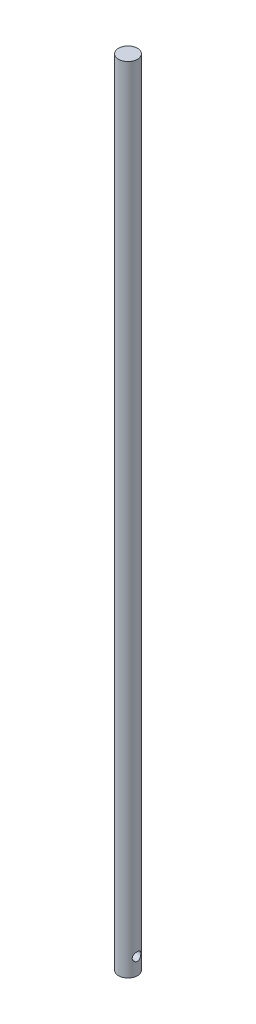
ISO-10303-21;
HEADER;
FILE_DESCRIPTION(('STEP AP214'),'2;1');
FILE_NAME('part.step','',(''),(''),'','','');
FILE_SCHEMA(('AUTOMOTIVE_DESIGN { 1 0 10303 214 1 1 1 1 }'));
ENDSEC;
DATA;
#1=APPLICATION_CONTEXT('core data for automotive mechanical design processes');
#2=APPLICATION_PROTOCOL_DEFINITION('international standard','automotive_design',2000,#1);
#3=PRODUCT_CONTEXT('',#1,'mechanical');
#4=PRODUCT('Part','Part','',(#3));
#5=PRODUCT_RELATED_PRODUCT_CATEGORY('part','',(#4));
#6=PRODUCT_DEFINITION_FORMATION('','',#4);
#7=PRODUCT_DEFINITION_CONTEXT('part definition',#1,'design');
#8=PRODUCT_DEFINITION('design','',#6,#7);
#9=PRODUCT_DEFINITION_SHAPE('','',#8);
#10=(LENGTH_UNIT() NAMED_UNIT(*) SI_UNIT(.MILLI.,.METRE.));
#11=(NAMED_UNIT(*) PLANE_ANGLE_UNIT() SI_UNIT($,.RADIAN.));
#12=(NAMED_UNIT(*) SI_UNIT($,.STERADIAN.) SOLID_ANGLE_UNIT());
#13=UNCERTAINTY_MEASURE_WITH_UNIT(LENGTH_MEASURE(1.E-05),#10,'distance_accuracy_value','');
#14=(GEOMETRIC_REPRESENTATION_CONTEXT(3) GLOBAL_UNCERTAINTY_ASSIGNED_CONTEXT((#13)) GLOBAL_UNIT_ASSIGNED_CONTEXT((#10,
#11,#12)) REPRESENTATION_CONTEXT('',''));
#15=CARTESIAN_POINT('',(0.,0.,0.));
#16=DIRECTION('',(0.,0.,1.));
#17=DIRECTION('',(1.,0.,0.));
#18=AXIS2_PLACEMENT_3D('',#15,#16,#17);
#19=CARTESIAN_POINT('',(0.,250.,0.));
#20=DIRECTION('',(0.,-1.,0.));
#21=DIRECTION('',(0.,0.,-1.));
#22=AXIS2_PLACEMENT_3D('',#19,#20,#21);
#23=CYLINDRICAL_SURFACE('',#22,3.);
#24=CARTESIAN_POINT('',(-3.,3.91574663824193,0.));
#25=CARTESIAN_POINT('',(-2.99999710819746,3.91575014774241,-0.0717942983232349));
#26=CARTESIAN_POINT('',(-2.99739409084056,3.92150750562833,-0.143698325746441));
#27=CARTESIAN_POINT('',(-2.98724013750941,3.94430633999122,-0.285432490024626));
#28=CARTESIAN_POINT('',(-2.97967753594657,3.96137442176057,-0.355257330555084));
#29=CARTESIAN_POINT('',(-2.96040619544781,4.0060215957581,-0.490559033821622));
#30=CARTESIAN_POINT('',(-2.94871240278778,4.03356282417566,-0.556050573075537));
#31=CARTESIAN_POINT('',(-2.92229198635354,4.09820285575136,-0.68140951127108));
#32=CARTESIAN_POINT('',(-2.90756600828684,4.13529962446719,-0.741278103679961));
#33=CARTESIAN_POINT('',(-2.87559272931306,4.22020448809954,-0.85718500175379));
#34=CARTESIAN_POINT('',(-2.85825436147132,4.26846772291394,-0.912864501031411));
#35=CARTESIAN_POINT('',(-2.8233655994703,4.37336807701762,-1.01565685650759));
#36=CARTESIAN_POINT('',(-2.80581508267312,4.43001027567851,-1.06276447748725));
#37=CARTESIAN_POINT('',(-2.77130585686826,4.55413391499867,-1.14986510805754));
#38=CARTESIAN_POINT('',(-2.75444463646883,4.62205998119229,-1.18926734777791));
#39=CARTESIAN_POINT('',(-2.72469944797672,4.76443551321034,-1.25592795928377));
#40=CARTESIAN_POINT('',(-2.71181310471532,4.83888104907521,-1.28319358757603));
#41=CARTESIAN_POINT('',(-2.69247896324617,4.98806256912473,-1.32326532420642));
#42=CARTESIAN_POINT('',(-2.68572383239536,5.06257033308896,-1.33676641560757));
#43=CARTESIAN_POINT('',(-2.67855223230496,5.21307587857966,-1.35108445296973));
#44=CARTESIAN_POINT('',(-2.67813136354141,5.28907258920513,-1.35191020272176));
#45=CARTESIAN_POINT('',(-2.6834202803121,5.4328958033276,-1.34137148509328));
#46=CARTESIAN_POINT('',(-2.68856813661517,5.500829312279,-1.33112445451752));
#47=CARTESIAN_POINT('',(-2.7034513561071,5.63388382410826,-1.30062891567465));
#48=CARTESIAN_POINT('',(-2.71318778475507,5.69900416993844,-1.28037808448852));
#49=CARTESIAN_POINT('',(-2.73637704262371,5.82634983747227,-1.23004883795921));
#50=CARTESIAN_POINT('',(-2.74990898685239,5.88847629723984,-1.19975839775641));
#51=CARTESIAN_POINT('',(-2.7791537278156,6.00703109509844,-1.13036295003033));
#52=CARTESIAN_POINT('',(-2.79486745146097,6.06345699365779,-1.09125419168812));
#53=CARTESIAN_POINT('',(-2.82861476581816,6.17495704280657,-1.00074678884709));
#54=CARTESIAN_POINT('',(-2.84672309557188,6.22933006707951,-0.94850964593217));
#55=CARTESIAN_POINT('',(-2.88191228554332,6.32880164053225,-0.835512963309816));
#56=CARTESIAN_POINT('',(-2.89899281837343,6.37389724549308,-0.774750728395018));
#57=CARTESIAN_POINT('',(-2.9308585664278,6.45480490345382,-0.643994003611888));
#58=CARTESIAN_POINT('',(-2.94555628131279,6.49028607758962,-0.573771818637792));
#59=CARTESIAN_POINT('',(-2.9703043427381,6.54867742111488,-0.427523890626996));
#60=CARTESIAN_POINT('',(-2.98035769270489,6.57159571648417,-0.351501935367015));
#61=CARTESIAN_POINT('',(-2.99409415860333,6.60263784221295,-0.201630556677326));
#62=CARTESIAN_POINT('',(-2.99818023391338,6.61169970443556,-0.128012475240639));
#63=CARTESIAN_POINT('',(-3.00084388971438,6.61762426250216,0.0198017129757708));
#64=CARTESIAN_POINT('',(-2.99942340479119,6.61449124269729,0.0939976076149024));
#65=CARTESIAN_POINT('',(-2.99148733912252,6.59674312127671,0.236163838261616));
#66=CARTESIAN_POINT('',(-2.98528201918371,6.58282696527219,0.304240885876224));
#67=CARTESIAN_POINT('',(-2.96875596530774,6.54492676043373,0.436995702745775));
#68=CARTESIAN_POINT('',(-2.95843473569757,6.52094149897374,0.501673061518975));
#69=CARTESIAN_POINT('',(-2.93424357362228,6.4628279105458,0.62808197066898));
#70=CARTESIAN_POINT('',(-2.92027320912254,6.42840718369706,0.689659229503894));
#71=CARTESIAN_POINT('',(-2.89022166549104,6.35071833291386,0.806385327743472));
#72=CARTESIAN_POINT('',(-2.87413956415871,6.30744633897804,0.861531338624963));
#73=CARTESIAN_POINT('',(-2.83992652839843,6.20913243823733,0.968623988015432));
#74=CARTESIAN_POINT('',(-2.82173597139227,6.15341443801544,1.01993241361648));
#75=CARTESIAN_POINT('',(-2.78646430195239,6.03395029990112,1.11269266003748));
#76=CARTESIAN_POINT('',(-2.76938361687061,5.97020109706636,1.15414070031002));
#77=CARTESIAN_POINT('',(-2.7379338081281,5.83429944191163,1.22692126341054));
#78=CARTESIAN_POINT('',(-2.72364526364247,5.76197368922184,1.25796777069468));
#79=CARTESIAN_POINT('',(-2.70039592602715,5.61226681040474,1.30713985771408));
#80=CARTESIAN_POINT('',(-2.69142975048318,5.53489087965261,1.3252784946468));
#81=CARTESIAN_POINT('',(-2.68075667169167,5.38445819097413,1.34672717395899));
#82=CARTESIAN_POINT('',(-2.67849069599059,5.31160397201614,1.35118055215424));
#83=CARTESIAN_POINT('',(-2.67994960996189,5.1662002490473,1.34828559635269));
#84=CARTESIAN_POINT('',(-2.68367313256576,5.09365067929118,1.34093995541462));
#85=CARTESIAN_POINT('',(-2.6961462980684,4.95568594494785,1.31566407238933));
#86=CARTESIAN_POINT('',(-2.70456348750257,4.8901096404399,1.29843197077116));
#87=CARTESIAN_POINT('',(-2.7251623303891,4.76279245681347,1.25462062200674));
#88=CARTESIAN_POINT('',(-2.73734507914543,4.70105269993148,1.22803865491526));
#89=CARTESIAN_POINT('',(-2.7650759189415,4.57878108907876,1.16431737308181));
#90=CARTESIAN_POINT('',(-2.78079077572678,4.5185859692411,1.12660616827383));
#91=CARTESIAN_POINT('',(-2.81342848547022,4.40502387022534,1.04242837649562));
#92=CARTESIAN_POINT('',(-2.83035185682753,4.35165984902868,0.995958018053227));
#93=CARTESIAN_POINT('',(-2.86533877617131,4.24827706458448,0.890607785832821));
#94=CARTESIAN_POINT('',(-2.88336671225994,4.198999404534,0.830985057931681));
#95=CARTESIAN_POINT('',(-2.91704362931292,4.11106187232284,0.703694018650894));
#96=CARTESIAN_POINT('',(-2.93269151464089,4.07240688365389,0.636022027250614));
#97=CARTESIAN_POINT('',(-2.95973519982059,4.00741499565908,0.495042929060335));
#98=CARTESIAN_POINT('',(-2.97117185469687,3.98095907707182,0.421798761424309));
#99=CARTESIAN_POINT('',(-2.98865352259014,3.94102879003669,0.271369105378996));
#100=CARTESIAN_POINT('',(-2.99471488298502,3.92751505166084,0.194196326987202));
#101=CARTESIAN_POINT('',(-2.99849167271413,3.91910192351512,0.0971012527230255));
#102=CARTESIAN_POINT('',(-2.99905628756061,3.9178449096661,0.077709011999783));
#103=CARTESIAN_POINT('',(-2.99981084536562,3.91616678606473,0.0388805308187737));
#104=CARTESIAN_POINT('',(-3.00000078319655,3.91574568775219,0.0194442897624908));
#105=CARTESIAN_POINT('',(-3.,3.91574663824193,0.));
#106=B_SPLINE_CURVE_WITH_KNOTS('',3,(#24,#25,#26,#27,#28,#29,#30,#31,#32,#33,#34,#35,#36,#37,
#38,#39,#40,#41,#42,#43,#44,#45,#46,#47,#48,#49,#50,#51,#52,#53,#54,#55,#56,#57,#58,#59,#60,#61,
#62,#63,#64,#65,#66,#67,#68,#69,#70,#71,#72,#73,#74,#75,#76,#77,#78,#79,#80,#81,#82,#83,#84,#85,
#86,#87,#88,#89,#90,#91,#92,#93,#94,#95,#96,#97,#98,#99,#100,#101,#102,#103,#104,#105),
.UNSPECIFIED.,.T.,.F.,(4,2,2,2,2,2,2,2,2,2,2,2,2,2,2,2,2,2,2,2,2,2,2,2,2,2,2,2,2,2,2,2,2,2,2,2,
2,2,2,2,4),(0.,0.215303084427218,0.43111441493177,0.6461528234083,0.861145486470537,
1.08726953424049,1.31353122563332,1.55326754039453,1.79286032311305,2.01964651955437,
2.24627519213992,2.45199894249931,2.65777048513474,2.86819857827374,3.07871634515167,
3.31031406768875,3.54198517551711,3.78083332859654,4.01952680594871,4.24120773308938,
4.46281078549605,4.67114116806696,4.87949664714236,5.094335578217,5.30926864394809,
5.54191493070127,5.77465027258591,6.01334164055914,6.25179121126566,6.46968869048819,
6.68753644292215,6.89161899090661,7.09576095718725,7.31311389683911,7.53056063789666,
7.76770791551892,8.00496403362732,8.23985367573746,8.4740264957455,8.53233695168291,
8.59064820561442),.UNSPECIFIED.);
#107=CARTESIAN_POINT('',(-3.,3.91574663824193,0.));
#108=VERTEX_POINT('',#107);
#109=EDGE_CURVE('E10',#108,#108,#106,.T.);
#110=ORIENTED_EDGE('',*,*,#109,.T.);
#111=EDGE_LOOP('',(#110));
#112=FACE_BOUND('',#111,.T.);
#113=CARTESIAN_POINT('',(2.67908566492376,5.26574663824193,-1.35));
#114=CARTESIAN_POINT('',(2.67908972136357,5.19436869180896,-1.34999634960117));
#115=CARTESIAN_POINT('',(2.68197986470892,5.12287744317763,-1.34430280693501));
#116=CARTESIAN_POINT('',(2.69314748719366,4.98200806306492,-1.3217815708751));
#117=CARTESIAN_POINT('',(2.70143841174077,4.9126356589582,-1.30492608775202));
#118=CARTESIAN_POINT('',(2.72226347568043,4.7782969681207,-1.26089890657752));
#119=CARTESIAN_POINT('',(2.73477832820249,4.71331223718618,-1.23377403224336));
#120=CARTESIAN_POINT('',(2.76261183069861,4.58883220867662,-1.1701189461529));
#121=CARTESIAN_POINT('',(2.77793013877675,4.52933624304757,-1.13358988106566));
#122=CARTESIAN_POINT('',(2.81089012139633,4.41315576995535,-1.04932009765931));
#123=CARTESIAN_POINT('',(2.82861845893337,4.35691767431883,-1.00099751939836));
#124=CARTESIAN_POINT('',(2.86369435251158,4.25300719428025,-0.8957298874375));
#125=CARTESIAN_POINT('',(2.88104174405689,4.2053384487464,-0.838781189587369));
#126=CARTESIAN_POINT('',(2.91448488106423,4.11750515804029,-0.714242041658825));
#127=CARTESIAN_POINT('',(2.9304683741236,4.07786078551025,-0.646251809658566));
#128=CARTESIAN_POINT('',(2.95829847107112,4.01077044979954,-0.503715605802076));
#129=CARTESIAN_POINT('',(2.97014720161912,3.98331821376914,-0.429173028829625));
#130=CARTESIAN_POINT('',(2.98775470090972,3.94306540129027,-0.28035217928494));
#131=CARTESIAN_POINT('',(2.99383392314784,3.92949012153148,-0.206322168674059));
#132=CARTESIAN_POINT('',(3.00039373369951,3.91485500144453,-0.0568029105740025));
#133=CARTESIAN_POINT('',(3.00087699987058,3.91378917490926,0.0186856216373246));
#134=CARTESIAN_POINT('',(2.99636545093253,3.92383740721556,0.163274958357676));
#135=CARTESIAN_POINT('',(2.9917559075982,3.93409481508108,0.232449739495251));
#136=CARTESIAN_POINT('',(2.97812620546336,3.96500554935348,0.367973075543692));
#137=CARTESIAN_POINT('',(2.96910571978628,3.98565964621903,0.434321420602955));
#138=CARTESIAN_POINT('',(2.94733568420856,4.03699346858729,0.563537397240552));
#139=CARTESIAN_POINT('',(2.93453157396088,4.06782071016267,0.626336852256068));
#140=CARTESIAN_POINT('',(2.90640952714529,4.13846441531887,0.746035931554187));
#141=CARTESIAN_POINT('',(2.89109067198747,4.17828416570142,0.802933387505527));
#142=CARTESIAN_POINT('',(2.85798888844785,4.26948013967415,0.914071051759804));
#143=CARTESIAN_POINT('',(2.84010687280163,4.32152713225195,0.967732040593638));
#144=CARTESIAN_POINT('',(2.80476557445095,4.43385101856169,1.06583995565248));
#145=CARTESIAN_POINT('',(2.78730651669438,4.49413218316803,1.1102820699331));
#146=CARTESIAN_POINT('',(2.75401135094477,4.62448804355893,1.1905438861065));
#147=CARTESIAN_POINT('',(2.7382791614958,4.6948751004443,1.2259032914578));
#148=CARTESIAN_POINT('',(2.71151624518558,4.84149506649843,1.28402300568714));
#149=CARTESIAN_POINT('',(2.70048151987999,4.91772293852335,1.30679403464254));
#150=CARTESIAN_POINT('',(2.68540623610429,5.06804288153497,1.33748549179434));
#151=CARTESIAN_POINT('',(2.68092046697284,5.1418954666207,1.34635462348056));
#152=CARTESIAN_POINT('',(2.67817358123965,5.29015422428383,1.3518134548202));
#153=CARTESIAN_POINT('',(2.6799096349927,5.36456012985354,1.34840873653788));
#154=CARTESIAN_POINT('',(2.68894505411098,5.50550673716775,1.33028529698142));
#155=CARTESIAN_POINT('',(2.69578776258231,5.57220012410927,1.31649446313373));
#156=CARTESIAN_POINT('',(2.71364654941982,5.70224643099921,1.27927525451619));
#157=CARTESIAN_POINT('',(2.72466371916185,5.76559847244403,1.25584435930022));
#158=CARTESIAN_POINT('',(2.75022888790585,5.89037554070962,1.1988557075006));
#159=CARTESIAN_POINT('',(2.76491376583275,5.95158465721017,1.1648887379257));
#160=CARTESIAN_POINT('',(2.79599373408588,6.0677568065337,1.08817756733451));
#161=CARTESIAN_POINT('',(2.81238963825979,6.1227168407789,1.0454291799988));
#162=CARTESIAN_POINT('',(2.84697800672908,6.23044196100648,0.94745326452943));
#163=CARTESIAN_POINT('',(2.86518924991743,6.2824657753479,0.891413865022649));
#164=CARTESIAN_POINT('',(2.89990574886455,6.37654256457674,0.77101798461923));
#165=CARTESIAN_POINT('',(2.91641073613078,6.41859397157191,0.706660198334779));
#166=CARTESIAN_POINT('',(2.9461052573818,6.49178432318406,0.570409325455866));
#167=CARTESIAN_POINT('',(2.95926013204552,6.52281040783407,0.49844757151942));
#168=CARTESIAN_POINT('',(2.98050950144873,6.57205238740189,0.349571723618872));
#169=CARTESIAN_POINT('',(2.98860756344568,6.59027731385245,0.272661163064111));
#170=CARTESIAN_POINT('',(2.99835968098045,6.61212926375855,0.122636888326819));
#171=CARTESIAN_POINT('',(3.00047260862348,6.61679654126696,0.0497037653946977));
#172=CARTESIAN_POINT('',(2.99934947885664,6.61430135086214,-0.0959089680211792));
#173=CARTESIAN_POINT('',(2.99611466133645,6.60714162507301,-0.16858863335479));
#174=CARTESIAN_POINT('',(2.98491784207744,6.58193522456876,-0.308129692375971));
#175=CARTESIAN_POINT('',(2.97718164482459,6.56440796706279,-0.375104669113067));
#176=CARTESIAN_POINT('',(2.95790278165172,6.51957960888502,-0.505107153197959));
#177=CARTESIAN_POINT('',(2.94635946005498,6.4922768245673,-0.568133978354382));
#178=CARTESIAN_POINT('',(2.91989573220559,6.42730180795475,-0.691651014019819));
#179=CARTESIAN_POINT('',(2.90484486776423,6.389211921455,-0.75189283481351));
#180=CARTESIAN_POINT('',(2.87307697231938,6.30431298950479,-0.865394775785757));
#181=CARTESIAN_POINT('',(2.85635922443299,6.25750018497058,-0.918651869019339));
#182=CARTESIAN_POINT('',(2.82141054489056,6.15204643335893,-1.02118014748473));
#183=CARTESIAN_POINT('',(2.80316664115845,6.09275486342009,-1.06977999794906));
#184=CARTESIAN_POINT('',(2.76852013319426,5.96638153274216,-1.15649637692138));
#185=CARTESIAN_POINT('',(2.75211871666422,5.89929480312979,-1.19460616603026));
#186=CARTESIAN_POINT('',(2.7231408374882,5.75846100379861,-1.25927503316014));
#187=CARTESIAN_POINT('',(2.71058811915896,5.68467609018456,-1.28576282547058));
#188=CARTESIAN_POINT('',(2.69134731904104,5.53304368565104,-1.32557656565208));
#189=CARTESIAN_POINT('',(2.68463956270378,5.45521076562754,-1.33894668780695));
#190=CARTESIAN_POINT('',(2.68062086017264,5.35834925349661,-1.34694881770107));
#191=CARTESIAN_POINT('',(2.68004645979514,5.33985431576149,-1.34809182836545));
#192=CARTESIAN_POINT('',(2.67927832920893,5.30282434772676,-1.34961790578098));
#193=CARTESIAN_POINT('',(2.67908461113529,5.28428931616793,-1.35000094830649));
#194=CARTESIAN_POINT('',(2.67908566492376,5.26574663824193,-1.35));
#195=B_SPLINE_CURVE_WITH_KNOTS('',3,(#113,#114,#115,#116,#117,#118,#119,#120,#121,#122,#123,
#124,#125,#126,#127,#128,#129,#130,#131,#132,#133,#134,#135,#136,#137,#138,#139,#140,#141,#142,
#143,#144,#145,#146,#147,#148,#149,#150,#151,#152,#153,#154,#155,#156,#157,#158,#159,#160,#161,
#162,#163,#164,#165,#166,#167,#168,#169,#170,#171,#172,#173,#174,#175,#176,#177,#178,#179,#180,
#181,#182,#183,#184,#185,#186,#187,#188,#189,#190,#191,#192,#193,#194),.UNSPECIFIED.,.T.,.F.,(4,
2,2,2,2,2,2,2,2,2,2,2,2,2,2,2,2,2,2,2,2,2,2,2,2,2,2,2,2,2,2,2,2,2,2,2,2,2,2,2,4),(0.,
0.214055845792532,0.428646637243886,0.642270551908941,0.855868431371099,1.08359761166759,
1.31142326708013,1.55111519146942,1.7906836511827,2.01599531824478,2.24119916146311,
2.45046498111008,2.65974631092609,2.87220645533555,3.08474438091332,3.31433040008769,
3.54403595561181,3.78375440668509,4.02326840132222,4.24558900401108,4.46780850954653,
4.67223214739968,4.87670926691682,5.09041213785303,5.30421712366117,5.53894745661197,
5.77371467014984,6.01082017062588,6.24775821883919,6.4659627629896,6.68411672290069,
6.89217009324631,7.10025931402203,7.31787915069571,7.53559298700253,7.77092535260829,
8.00640855780262,8.24331661272665,8.47942410351746,8.53503010348214,8.5906378759814),.UNSPECIFIED.);
#196=CARTESIAN_POINT('',(2.67908566492376,5.26574663824193,-1.35));
#197=VERTEX_POINT('',#196);
#198=EDGE_CURVE('E50',#197,#197,#195,.T.);
#199=ORIENTED_EDGE('',*,*,#198,.T.);
#200=EDGE_LOOP('',(#199));
#201=FACE_BOUND('',#200,.T.);
#202=CARTESIAN_POINT('',(0.,250.,0.));
#203=DIRECTION('',(0.,1.,0.));
#204=DIRECTION('',(0.,0.,1.));
#205=AXIS2_PLACEMENT_3D('',#202,#203,#204);
#206=CIRCLE('',#205,3.);
#207=CARTESIAN_POINT('',(0.,250.,3.));
#208=VERTEX_POINT('',#207);
#209=EDGE_CURVE('E54',#208,#208,#206,.T.);
#210=ORIENTED_EDGE('',*,*,#209,.F.);
#211=EDGE_LOOP('',(#210));
#212=FACE_BOUND('',#211,.T.);
#213=CARTESIAN_POINT('',(0.,0.,0.));
#214=DIRECTION('',(0.,1.,0.));
#215=DIRECTION('',(0.,0.,1.));
#216=AXIS2_PLACEMENT_3D('',#213,#214,#215);
#217=CIRCLE('',#216,3.);
#218=CARTESIAN_POINT('',(0.,0.,3.));
#219=VERTEX_POINT('',#218);
#220=EDGE_CURVE('E58',#219,#219,#217,.T.);
#221=ORIENTED_EDGE('',*,*,#220,.T.);
#222=EDGE_LOOP('',(#221));
#223=FACE_BOUND('',#222,.T.);
#224=ADVANCED_FACE('F39',(#112,#201,#212,#223),#23,.T.);
#225=CARTESIAN_POINT('',(0.,250.,0.));
#226=DIRECTION('',(0.,1.,0.));
#227=DIRECTION('',(0.,0.,1.));
#228=AXIS2_PLACEMENT_3D('',#225,#226,#227);
#229=PLANE('',#228);
#230=ORIENTED_EDGE('',*,*,#209,.T.);
#231=EDGE_LOOP('',(#230));
#232=FACE_BOUND('',#231,.T.);
#233=ADVANCED_FACE('F70',(#232),#229,.T.);
#234=CARTESIAN_POINT('',(0.,0.,0.));
#235=DIRECTION('',(0.,1.,0.));
#236=DIRECTION('',(0.,0.,1.));
#237=AXIS2_PLACEMENT_3D('',#234,#235,#236);
#238=PLANE('',#237);
#239=ORIENTED_EDGE('',*,*,#220,.F.);
#240=EDGE_LOOP('',(#239));
#241=FACE_BOUND('',#240,.T.);
#242=ADVANCED_FACE('F68',(#241),#238,.F.);
#243=CARTESIAN_POINT('',(-3.,5.26574663824193,0.));
#244=DIRECTION('',(1.,0.,0.));
#245=DIRECTION('',(0.,0.,-1.));
#246=AXIS2_PLACEMENT_3D('',#243,#244,#245);
#247=CYLINDRICAL_SURFACE('',#246,1.35);
#248=ORIENTED_EDGE('',*,*,#198,.F.);
#249=EDGE_LOOP('',(#248));
#250=FACE_BOUND('',#249,.T.);
#251=ORIENTED_EDGE('',*,*,#109,.F.);
#252=EDGE_LOOP('',(#251));
#253=FACE_BOUND('',#252,.T.);
#254=ADVANCED_FACE('F64',(#250,#253),#247,.F.);
#255=CLOSED_SHELL('',(#224,#233,#242,#254));
#256=MANIFOLD_SOLID_BREP('B2',#255);
#257=ADVANCED_BREP_SHAPE_REPRESENTATION('',(#18,#256),#14);
#258=SHAPE_DEFINITION_REPRESENTATION(#9,#257);
ENDSEC;
END-ISO-10303-21;
